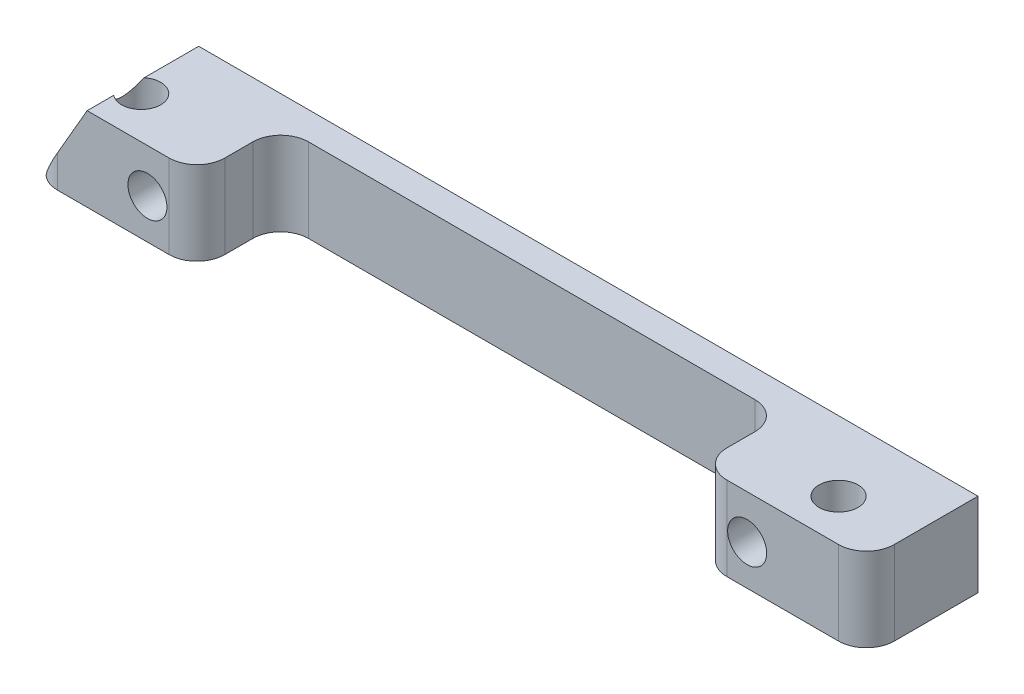
ISO-10303-21;
HEADER;
FILE_DESCRIPTION(('STEP AP214'),'2;1');
FILE_NAME('part.step','',(''),(''),'','','');
FILE_SCHEMA(('AUTOMOTIVE_DESIGN { 1 0 10303 214 1 1 1 1 }'));
ENDSEC;
DATA;
#1=APPLICATION_CONTEXT('core data for automotive mechanical design processes');
#2=APPLICATION_PROTOCOL_DEFINITION('international standard','automotive_design',2000,#1);
#3=PRODUCT_CONTEXT('',#1,'mechanical');
#4=PRODUCT('Part','Part','',(#3));
#5=PRODUCT_RELATED_PRODUCT_CATEGORY('part','',(#4));
#6=PRODUCT_DEFINITION_FORMATION('','',#4);
#7=PRODUCT_DEFINITION_CONTEXT('part definition',#1,'design');
#8=PRODUCT_DEFINITION('design','',#6,#7);
#9=PRODUCT_DEFINITION_SHAPE('','',#8);
#10=(LENGTH_UNIT() NAMED_UNIT(*) SI_UNIT(.MILLI.,.METRE.));
#11=(NAMED_UNIT(*) PLANE_ANGLE_UNIT() SI_UNIT($,.RADIAN.));
#12=(NAMED_UNIT(*) SI_UNIT($,.STERADIAN.) SOLID_ANGLE_UNIT());
#13=UNCERTAINTY_MEASURE_WITH_UNIT(LENGTH_MEASURE(1.E-05),#10,'distance_accuracy_value','');
#14=(GEOMETRIC_REPRESENTATION_CONTEXT(3) GLOBAL_UNCERTAINTY_ASSIGNED_CONTEXT((#13)) GLOBAL_UNIT_ASSIGNED_CONTEXT((#10,
#11,#12)) REPRESENTATION_CONTEXT('',''));
#15=CARTESIAN_POINT('',(0.,0.,0.));
#16=DIRECTION('',(0.,0.,1.));
#17=DIRECTION('',(1.,0.,0.));
#18=AXIS2_PLACEMENT_3D('',#15,#16,#17);
#19=CARTESIAN_POINT('',(-29.9999999999998,3.,2.));
#20=DIRECTION('',(0.,-1.,0.));
#21=DIRECTION('',(0.,0.,-1.));
#22=AXIS2_PLACEMENT_3D('',#19,#20,#21);
#23=PLANE('',#22);
#24=CARTESIAN_POINT('',(24.9999999999998,3.,5.));
#25=DIRECTION('',(0.,-1.,0.));
#26=DIRECTION('',(0.,0.,-1.));
#27=AXIS2_PLACEMENT_3D('',#24,#25,#26);
#28=CIRCLE('',#27,1.4);
#29=CARTESIAN_POINT('',(24.9999999999998,3.,3.6));
#30=VERTEX_POINT('',#29);
#31=EDGE_CURVE('E287',#30,#30,#28,.F.);
#32=ORIENTED_EDGE('',*,*,#31,.F.);
#33=EDGE_LOOP('',(#32));
#34=FACE_BOUND('',#33,.T.);
#35=DIRECTION('',(0.,0.,-1.));
#36=VECTOR('',#35,1.);
#37=CARTESIAN_POINT('',(-25.8754324738564,3.,8.00100000000001));
#38=LINE('',#37,#36);
#39=CARTESIAN_POINT('',(-25.8754324738564,3.,3.90747174694746));
#40=VERTEX_POINT('',#39);
#41=CARTESIAN_POINT('',(-25.8754324738564,3.,0.));
#42=VERTEX_POINT('',#41);
#43=EDGE_CURVE('E147',#40,#42,#38,.T.);
#44=ORIENTED_EDGE('',*,*,#43,.F.);
#45=CARTESIAN_POINT('',(-25.0000000000002,3.,5.));
#46=DIRECTION('',(0.,-1.,0.));
#47=DIRECTION('',(0.,0.,-1.));
#48=AXIS2_PLACEMENT_3D('',#45,#46,#47);
#49=CIRCLE('',#48,1.4);
#50=CARTESIAN_POINT('',(-25.8754324738564,3.,6.09252825305254));
#51=VERTEX_POINT('',#50);
#52=EDGE_CURVE('E46',#51,#40,#49,.F.);
#53=ORIENTED_EDGE('',*,*,#52,.F.);
#54=CARTESIAN_POINT('',(-25.8754324738564,3.,8.00000000000001));
#55=VERTEX_POINT('',#54);
#56=EDGE_CURVE('E144',#55,#51,#38,.T.);
#57=ORIENTED_EDGE('',*,*,#56,.F.);
#58=DIRECTION('',(-1.,0.,0.));
#59=VECTOR('',#58,1.);
#60=CARTESIAN_POINT('',(-25.0000000000002,3.,8.00000000000001));
#61=LINE('',#60,#59);
#62=CARTESIAN_POINT('',(-19.9999999999998,3.,8.00000000000001));
#63=VERTEX_POINT('',#62);
#64=EDGE_CURVE('E175',#63,#55,#61,.T.);
#65=ORIENTED_EDGE('',*,*,#64,.F.);
#66=CARTESIAN_POINT('',(-19.9999999999998,3.,6.00000000000001));
#67=DIRECTION('',(0.,-1.,0.));
#68=DIRECTION('',(0.,0.,-1.));
#69=AXIS2_PLACEMENT_3D('',#66,#67,#68);
#70=CIRCLE('',#69,2.);
#71=CARTESIAN_POINT('',(-17.9999999999998,3.,6.00000000000001));
#72=VERTEX_POINT('',#71);
#73=EDGE_CURVE('E234',#63,#72,#70,.F.);
#74=ORIENTED_EDGE('',*,*,#73,.T.);
#75=DIRECTION('',(0.,0.,1.));
#76=VECTOR('',#75,1.);
#77=CARTESIAN_POINT('',(-17.9999999999998,3.,8.00000000000001));
#78=LINE('',#77,#76);
#79=CARTESIAN_POINT('',(-17.9999999999998,3.,4.));
#80=VERTEX_POINT('',#79);
#81=EDGE_CURVE('E172',#80,#72,#78,.T.);
#82=ORIENTED_EDGE('',*,*,#81,.F.);
#83=CARTESIAN_POINT('',(-15.9999999999998,3.,4.));
#84=DIRECTION('',(0.,-1.,0.));
#85=DIRECTION('',(0.,0.,-1.));
#86=AXIS2_PLACEMENT_3D('',#83,#84,#85);
#87=CIRCLE('',#86,2.);
#88=CARTESIAN_POINT('',(-15.9999999999998,3.,2.));
#89=VERTEX_POINT('',#88);
#90=EDGE_CURVE('E244',#80,#89,#87,.T.);
#91=ORIENTED_EDGE('',*,*,#90,.T.);
#92=DIRECTION('',(-1.,0.,0.));
#93=VECTOR('',#92,1.);
#94=CARTESIAN_POINT('',(-29.9999999999998,3.,2.));
#95=LINE('',#94,#93);
#96=CARTESIAN_POINT('',(15.9999999999998,3.,2.));
#97=VERTEX_POINT('',#96);
#98=EDGE_CURVE('E183',#97,#89,#95,.T.);
#99=ORIENTED_EDGE('',*,*,#98,.F.);
#100=CARTESIAN_POINT('',(15.9999999999998,3.,4.));
#101=DIRECTION('',(0.,-1.,0.));
#102=DIRECTION('',(0.,0.,-1.));
#103=AXIS2_PLACEMENT_3D('',#100,#101,#102);
#104=CIRCLE('',#103,2.);
#105=CARTESIAN_POINT('',(17.9999999999998,3.,4.));
#106=VERTEX_POINT('',#105);
#107=EDGE_CURVE('E11',#97,#106,#104,.T.);
#108=ORIENTED_EDGE('',*,*,#107,.T.);
#109=DIRECTION('',(0.,0.,-1.));
#110=VECTOR('',#109,1.);
#111=CARTESIAN_POINT('',(17.9999999999998,3.,8.));
#112=LINE('',#111,#110);
#113=CARTESIAN_POINT('',(17.9999999999998,3.,6.));
#114=VERTEX_POINT('',#113);
#115=EDGE_CURVE('E163',#114,#106,#112,.T.);
#116=ORIENTED_EDGE('',*,*,#115,.F.);
#117=CARTESIAN_POINT('',(19.9999999999998,3.,6.));
#118=DIRECTION('',(0.,-1.,0.));
#119=DIRECTION('',(0.,0.,-1.));
#120=AXIS2_PLACEMENT_3D('',#117,#118,#119);
#121=CIRCLE('',#120,2.);
#122=CARTESIAN_POINT('',(19.9999999999998,3.,8.));
#123=VERTEX_POINT('',#122);
#124=EDGE_CURVE('E232',#114,#123,#121,.F.);
#125=ORIENTED_EDGE('',*,*,#124,.T.);
#126=DIRECTION('',(-1.,0.,0.));
#127=VECTOR('',#126,1.);
#128=CARTESIAN_POINT('',(29.9999999999998,3.,8.));
#129=LINE('',#128,#127);
#130=CARTESIAN_POINT('',(27.9999999999998,3.,8.));
#131=VERTEX_POINT('',#130);
#132=EDGE_CURVE('E160',#131,#123,#129,.T.);
#133=ORIENTED_EDGE('',*,*,#132,.F.);
#134=CARTESIAN_POINT('',(27.9999999999998,3.,6.));
#135=DIRECTION('',(0.,-1.,0.));
#136=DIRECTION('',(0.,0.,-1.));
#137=AXIS2_PLACEMENT_3D('',#134,#135,#136);
#138=CIRCLE('',#137,2.);
#139=CARTESIAN_POINT('',(29.9999999999998,3.,6.));
#140=VERTEX_POINT('',#139);
#141=EDGE_CURVE('E236',#131,#140,#138,.F.);
#142=ORIENTED_EDGE('',*,*,#141,.T.);
#143=DIRECTION('',(0.,0.,-1.));
#144=VECTOR('',#143,1.);
#145=CARTESIAN_POINT('',(29.9999999999998,3.,2.));
#146=LINE('',#145,#144);
#147=CARTESIAN_POINT('',(29.9999999999998,3.,0.));
#148=VERTEX_POINT('',#147);
#149=EDGE_CURVE('E198',#140,#148,#146,.T.);
#150=ORIENTED_EDGE('',*,*,#149,.T.);
#151=DIRECTION('',(-1.,0.,0.));
#152=VECTOR('',#151,1.);
#153=CARTESIAN_POINT('',(-29.9999999999998,3.,0.));
#154=LINE('',#153,#152);
#155=EDGE_CURVE('E193',#148,#42,#154,.T.);
#156=ORIENTED_EDGE('',*,*,#155,.T.);
#157=EDGE_LOOP('',(#44,#53,#57,#65,#74,#82,#91,#99,#108,#116,#125,#133,#142,#150,#156));
#158=FACE_BOUND('',#157,.T.);
#159=ADVANCED_FACE('F32',(#34,#158),#23,.F.);
#160=CARTESIAN_POINT('',(-29.9999999999998,-3.,2.));
#161=DIRECTION('',(0.,1.,0.));
#162=DIRECTION('',(0.,0.,1.));
#163=AXIS2_PLACEMENT_3D('',#160,#161,#162);
#164=PLANE('',#163);
#165=CARTESIAN_POINT('',(24.9999999999998,-3.,5.));
#166=DIRECTION('',(0.,-1.,0.));
#167=DIRECTION('',(0.,0.,-1.));
#168=AXIS2_PLACEMENT_3D('',#165,#166,#167);
#169=CIRCLE('',#168,1.4);
#170=CARTESIAN_POINT('',(24.9999999999998,-3.,3.6));
#171=VERTEX_POINT('',#170);
#172=EDGE_CURVE('E148',#171,#171,#169,.T.);
#173=ORIENTED_EDGE('',*,*,#172,.F.);
#174=EDGE_LOOP('',(#173));
#175=FACE_BOUND('',#174,.T.);
#176=CARTESIAN_POINT('',(-25.0000000000002,-3.,5.));
#177=DIRECTION('',(0.,-1.,0.));
#178=DIRECTION('',(0.,0.,-1.));
#179=AXIS2_PLACEMENT_3D('',#176,#177,#178);
#180=CIRCLE('',#179,1.4);
#181=CARTESIAN_POINT('',(-25.0000000000002,-3.,3.6));
#182=VERTEX_POINT('',#181);
#183=EDGE_CURVE('E139',#182,#182,#180,.T.);
#184=ORIENTED_EDGE('',*,*,#183,.F.);
#185=EDGE_LOOP('',(#184));
#186=FACE_BOUND('',#185,.T.);
#187=DIRECTION('',(0.,0.,-1.));
#188=VECTOR('',#187,1.);
#189=CARTESIAN_POINT('',(-29.3395340889941,-3.,8.00100000000001));
#190=LINE('',#189,#188);
#191=CARTESIAN_POINT('',(-29.3395340889941,-3.,7.48514256030264));
#192=VERTEX_POINT('',#191);
#193=CARTESIAN_POINT('',(-29.3395340889941,-3.,0.));
#194=VERTEX_POINT('',#193);
#195=EDGE_CURVE('E54',#192,#194,#190,.T.);
#196=ORIENTED_EDGE('',*,*,#195,.T.);
#197=DIRECTION('',(1.,0.,0.));
#198=VECTOR('',#197,1.);
#199=CARTESIAN_POINT('',(-29.9999999999998,-3.,0.));
#200=LINE('',#199,#198);
#201=CARTESIAN_POINT('',(29.9999999999998,-3.,0.));
#202=VERTEX_POINT('',#201);
#203=EDGE_CURVE('E187',#194,#202,#200,.T.);
#204=ORIENTED_EDGE('',*,*,#203,.T.);
#205=DIRECTION('',(0.,0.,-1.));
#206=VECTOR('',#205,1.);
#207=CARTESIAN_POINT('',(29.9999999999998,-3.,2.));
#208=LINE('',#207,#206);
#209=CARTESIAN_POINT('',(29.9999999999998,-3.,6.));
#210=VERTEX_POINT('',#209);
#211=EDGE_CURVE('E190',#210,#202,#208,.T.);
#212=ORIENTED_EDGE('',*,*,#211,.F.);
#213=CARTESIAN_POINT('',(27.9999999999998,-3.,6.));
#214=DIRECTION('',(0.,1.,0.));
#215=DIRECTION('',(0.,0.,1.));
#216=AXIS2_PLACEMENT_3D('',#213,#214,#215);
#217=CIRCLE('',#216,2.);
#218=CARTESIAN_POINT('',(27.9999999999998,-3.,8.));
#219=VERTEX_POINT('',#218);
#220=EDGE_CURVE('E225',#210,#219,#217,.F.);
#221=ORIENTED_EDGE('',*,*,#220,.T.);
#222=DIRECTION('',(1.,0.,0.));
#223=VECTOR('',#222,1.);
#224=CARTESIAN_POINT('',(29.9999999999998,-3.,8.));
#225=LINE('',#224,#223);
#226=CARTESIAN_POINT('',(19.9999999999998,-3.,8.));
#227=VERTEX_POINT('',#226);
#228=EDGE_CURVE('E164',#227,#219,#225,.T.);
#229=ORIENTED_EDGE('',*,*,#228,.F.);
#230=CARTESIAN_POINT('',(19.9999999999998,-3.,6.));
#231=DIRECTION('',(0.,1.,0.));
#232=DIRECTION('',(0.,0.,1.));
#233=AXIS2_PLACEMENT_3D('',#230,#231,#232);
#234=CIRCLE('',#233,2.);
#235=CARTESIAN_POINT('',(17.9999999999998,-3.,6.));
#236=VERTEX_POINT('',#235);
#237=EDGE_CURVE('E218',#227,#236,#234,.F.);
#238=ORIENTED_EDGE('',*,*,#237,.T.);
#239=DIRECTION('',(0.,0.,1.));
#240=VECTOR('',#239,1.);
#241=CARTESIAN_POINT('',(17.9999999999998,-3.,8.));
#242=LINE('',#241,#240);
#243=CARTESIAN_POINT('',(17.9999999999998,-3.,4.));
#244=VERTEX_POINT('',#243);
#245=EDGE_CURVE('E154',#244,#236,#242,.T.);
#246=ORIENTED_EDGE('',*,*,#245,.F.);
#247=CARTESIAN_POINT('',(15.9999999999998,-3.,4.));
#248=DIRECTION('',(0.,1.,0.));
#249=DIRECTION('',(0.,0.,1.));
#250=AXIS2_PLACEMENT_3D('',#247,#248,#249);
#251=CIRCLE('',#250,2.);
#252=CARTESIAN_POINT('',(15.9999999999998,-3.,2.));
#253=VERTEX_POINT('',#252);
#254=EDGE_CURVE('E40',#244,#253,#251,.T.);
#255=ORIENTED_EDGE('',*,*,#254,.T.);
#256=DIRECTION('',(1.,0.,0.));
#257=VECTOR('',#256,1.);
#258=CARTESIAN_POINT('',(-29.9999999999998,-3.,2.));
#259=LINE('',#258,#257);
#260=CARTESIAN_POINT('',(-15.9999999999998,-3.,2.));
#261=VERTEX_POINT('',#260);
#262=EDGE_CURVE('E186',#261,#253,#259,.T.);
#263=ORIENTED_EDGE('',*,*,#262,.F.);
#264=CARTESIAN_POINT('',(-15.9999999999998,-3.,4.));
#265=DIRECTION('',(0.,1.,0.));
#266=DIRECTION('',(0.,0.,1.));
#267=AXIS2_PLACEMENT_3D('',#264,#265,#266);
#268=CIRCLE('',#267,2.);
#269=CARTESIAN_POINT('',(-17.9999999999998,-3.,4.));
#270=VERTEX_POINT('',#269);
#271=EDGE_CURVE('E242',#261,#270,#268,.T.);
#272=ORIENTED_EDGE('',*,*,#271,.T.);
#273=DIRECTION('',(0.,0.,-1.));
#274=VECTOR('',#273,1.);
#275=CARTESIAN_POINT('',(-17.9999999999998,-3.,8.00000000000001));
#276=LINE('',#275,#274);
#277=CARTESIAN_POINT('',(-17.9999999999998,-3.,6.00000000000001));
#278=VERTEX_POINT('',#277);
#279=EDGE_CURVE('E176',#278,#270,#276,.T.);
#280=ORIENTED_EDGE('',*,*,#279,.F.);
#281=CARTESIAN_POINT('',(-19.9999999999998,-3.,6.00000000000001));
#282=DIRECTION('',(0.,1.,0.));
#283=DIRECTION('',(0.,0.,1.));
#284=AXIS2_PLACEMENT_3D('',#281,#282,#283);
#285=CIRCLE('',#284,2.);
#286=CARTESIAN_POINT('',(-19.9999999999998,-3.,8.00000000000001));
#287=VERTEX_POINT('',#286);
#288=EDGE_CURVE('E220',#278,#287,#285,.F.);
#289=ORIENTED_EDGE('',*,*,#288,.T.);
#290=DIRECTION('',(1.,0.,0.));
#291=VECTOR('',#290,1.);
#292=CARTESIAN_POINT('',(-25.0000000000002,-3.,8.00000000000001));
#293=LINE('',#292,#291);
#294=CARTESIAN_POINT('',(-27.9999999999998,-3.,8.00000000000001));
#295=VERTEX_POINT('',#294);
#296=EDGE_CURVE('E167',#295,#287,#293,.T.);
#297=ORIENTED_EDGE('',*,*,#296,.F.);
#298=CARTESIAN_POINT('',(-27.9999999999998,-3.,6.00000000000001));
#299=DIRECTION('',(0.,1.,0.));
#300=DIRECTION('',(0.,0.,1.));
#301=AXIS2_PLACEMENT_3D('',#298,#299,#300);
#302=CIRCLE('',#301,2.);
#303=EDGE_CURVE('E222',#295,#192,#302,.F.);
#304=ORIENTED_EDGE('',*,*,#303,.T.);
#305=EDGE_LOOP('',(#196,#204,#212,#221,#229,#238,#246,#255,#263,#272,#280,#289,#297,#304));
#306=FACE_BOUND('',#305,.T.);
#307=ADVANCED_FACE('F248',(#175,#186,#306),#164,.F.);
#308=CARTESIAN_POINT('',(0.,0.,0.));
#309=DIRECTION('',(0.,0.,1.));
#310=DIRECTION('',(1.,0.,0.));
#311=AXIS2_PLACEMENT_3D('',#308,#309,#310);
#312=PLANE('',#311);
#313=CARTESIAN_POINT('',(21.4479999999999,-0.126200000000067,0.));
#314=DIRECTION('',(0.,0.,1.));
#315=DIRECTION('',(1.,0.,0.));
#316=AXIS2_PLACEMENT_3D('',#313,#314,#315);
#317=CIRCLE('',#316,1.4);
#318=CARTESIAN_POINT('',(22.8479999999999,-0.126200000000067,0.));
#319=VERTEX_POINT('',#318);
#320=EDGE_CURVE('E292',#319,#319,#317,.T.);
#321=ORIENTED_EDGE('',*,*,#320,.T.);
#322=EDGE_LOOP('',(#321));
#323=FACE_BOUND('',#322,.T.);
#324=CARTESIAN_POINT('',(-21.5520000000001,-0.126200000000369,0.));
#325=DIRECTION('',(0.,0.,1.));
#326=DIRECTION('',(1.,0.,0.));
#327=AXIS2_PLACEMENT_3D('',#324,#325,#326);
#328=CIRCLE('',#327,1.4);
#329=CARTESIAN_POINT('',(-20.1520000000001,-0.126200000000369,0.));
#330=VERTEX_POINT('',#329);
#331=EDGE_CURVE('E300',#330,#330,#328,.T.);
#332=ORIENTED_EDGE('',*,*,#331,.T.);
#333=EDGE_LOOP('',(#332));
#334=FACE_BOUND('',#333,.T.);
#335=DIRECTION('',(0.499999999999998,0.86602540378444,0.));
#336=VECTOR('',#335,1.);
#337=CARTESIAN_POINT('',(-25.8754324738564,3.,0.));
#338=LINE('',#337,#336);
#339=EDGE_CURVE('E156',#194,#42,#338,.T.);
#340=ORIENTED_EDGE('',*,*,#339,.T.);
#341=ORIENTED_EDGE('',*,*,#155,.F.);
#342=DIRECTION('',(0.,1.,0.));
#343=VECTOR('',#342,1.);
#344=CARTESIAN_POINT('',(29.9999999999998,3.,0.));
#345=LINE('',#344,#343);
#346=EDGE_CURVE('E178',#202,#148,#345,.T.);
#347=ORIENTED_EDGE('',*,*,#346,.F.);
#348=ORIENTED_EDGE('',*,*,#203,.F.);
#349=EDGE_LOOP('',(#340,#341,#347,#348));
#350=FACE_BOUND('',#349,.T.);
#351=ADVANCED_FACE('F283',(#323,#334,#350),#312,.F.);
#352=CARTESIAN_POINT('',(-25.0000000000002,16.4164078649987,8.00000000000001));
#353=DIRECTION('',(0.,0.,-1.));
#354=DIRECTION('',(-1.,0.,0.));
#355=AXIS2_PLACEMENT_3D('',#352,#353,#354);
#356=PLANE('',#355);
#357=CARTESIAN_POINT('',(-21.5520000000001,-0.126200000000369,8.00000000000001));
#358=DIRECTION('',(0.,0.,-1.));
#359=DIRECTION('',(-1.,0.,0.));
#360=AXIS2_PLACEMENT_3D('',#357,#358,#359);
#361=CIRCLE('',#360,1.4);
#362=CARTESIAN_POINT('',(-22.9520000000001,-0.126200000000369,8.00000000000001));
#363=VERTEX_POINT('',#362);
#364=EDGE_CURVE('E297',#363,#363,#361,.T.);
#365=ORIENTED_EDGE('',*,*,#364,.T.);
#366=EDGE_LOOP('',(#365));
#367=FACE_BOUND('',#366,.T.);
#368=DIRECTION('',(-0.499999999999998,-0.86602540378444,0.));
#369=VECTOR('',#368,1.);
#370=CARTESIAN_POINT('',(-25.8754324738564,3.,8.00000000000001));
#371=LINE('',#370,#369);
#372=CARTESIAN_POINT('',(-27.9999999999998,-0.6798588993914,8.00000000000001));
#373=VERTEX_POINT('',#372);
#374=EDGE_CURVE('E152',#55,#373,#371,.T.);
#375=ORIENTED_EDGE('',*,*,#374,.T.);
#376=DIRECTION('',(0.,-1.,0.));
#377=VECTOR('',#376,1.);
#378=CARTESIAN_POINT('',(-27.9999999999998,16.4164078649987,8.00000000000001));
#379=LINE('',#378,#377);
#380=EDGE_CURVE('E240',#373,#295,#379,.T.);
#381=ORIENTED_EDGE('',*,*,#380,.T.);
#382=ORIENTED_EDGE('',*,*,#296,.T.);
#383=DIRECTION('',(0.,-1.,0.));
#384=VECTOR('',#383,1.);
#385=CARTESIAN_POINT('',(-19.9999999999998,16.4164078649987,8.00000000000001));
#386=LINE('',#385,#384);
#387=EDGE_CURVE('E238',#287,#63,#386,.F.);
#388=ORIENTED_EDGE('',*,*,#387,.T.);
#389=ORIENTED_EDGE('',*,*,#64,.T.);
#390=EDGE_LOOP('',(#375,#381,#382,#388,#389));
#391=FACE_BOUND('',#390,.T.);
#392=ADVANCED_FACE('F354',(#367,#391),#356,.F.);
#393=CARTESIAN_POINT('',(-27.9999999999998,16.4164078649987,6.00000000000001));
#394=DIRECTION('',(0.,-1.,0.));
#395=DIRECTION('',(0.,0.,-1.));
#396=AXIS2_PLACEMENT_3D('',#393,#394,#395);
#397=CYLINDRICAL_SURFACE('',#396,2.);
#398=ORIENTED_EDGE('',*,*,#380,.F.);
#399=CARTESIAN_POINT('',(-27.9999999999998,-0.6798588993914,6.00000000000001));
#400=DIRECTION('',(-0.86602540378444,0.499999999999998,0.));
#401=DIRECTION('',(-0.499999999999998,-0.86602540378444,0.));
#402=AXIS2_PLACEMENT_3D('',#399,#400,#401);
#403=ELLIPSE('',#402,4.00000000000002,2.);
#404=EDGE_CURVE('E284',#192,#373,#403,.T.);
#405=ORIENTED_EDGE('',*,*,#404,.F.);
#406=ORIENTED_EDGE('',*,*,#303,.F.);
#407=EDGE_LOOP('',(#398,#405,#406));
#408=FACE_BOUND('',#407,.T.);
#409=ADVANCED_FACE('F352',(#408),#397,.T.);
#410=CARTESIAN_POINT('',(0.,0.,2.));
#411=DIRECTION('',(0.,0.,1.));
#412=DIRECTION('',(1.,0.,0.));
#413=AXIS2_PLACEMENT_3D('',#410,#411,#412);
#414=PLANE('',#413);
#415=ORIENTED_EDGE('',*,*,#98,.T.);
#416=DIRECTION('',(0.,-1.,0.));
#417=VECTOR('',#416,1.);
#418=CARTESIAN_POINT('',(-15.9999999999998,0.,2.));
#419=LINE('',#418,#417);
#420=EDGE_CURVE('E202',#89,#261,#419,.T.);
#421=ORIENTED_EDGE('',*,*,#420,.T.);
#422=ORIENTED_EDGE('',*,*,#262,.T.);
#423=DIRECTION('',(0.,-1.,0.));
#424=VECTOR('',#423,1.);
#425=CARTESIAN_POINT('',(15.9999999999998,0.,2.));
#426=LINE('',#425,#424);
#427=EDGE_CURVE('E200',#253,#97,#426,.F.);
#428=ORIENTED_EDGE('',*,*,#427,.T.);
#429=EDGE_LOOP('',(#415,#421,#422,#428));
#430=FACE_BOUND('',#429,.T.);
#431=ADVANCED_FACE('F253',(#430),#414,.T.);
#432=CARTESIAN_POINT('',(29.9999999999998,3.,2.));
#433=DIRECTION('',(-1.,0.,0.));
#434=DIRECTION('',(0.,0.,1.));
#435=AXIS2_PLACEMENT_3D('',#432,#433,#434);
#436=PLANE('',#435);
#437=ORIENTED_EDGE('',*,*,#149,.F.);
#438=DIRECTION('',(0.,-1.,0.));
#439=VECTOR('',#438,1.);
#440=CARTESIAN_POINT('',(29.9999999999998,3.,6.));
#441=LINE('',#440,#439);
#442=EDGE_CURVE('E215',#140,#210,#441,.T.);
#443=ORIENTED_EDGE('',*,*,#442,.T.);
#444=ORIENTED_EDGE('',*,*,#211,.T.);
#445=ORIENTED_EDGE('',*,*,#346,.T.);
#446=EDGE_LOOP('',(#437,#443,#444,#445));
#447=FACE_BOUND('',#446,.T.);
#448=ADVANCED_FACE('F277',(#447),#436,.F.);
#449=CARTESIAN_POINT('',(-17.9999999999998,16.4164078649987,8.00000000000001));
#450=DIRECTION('',(-1.,0.,0.));
#451=DIRECTION('',(0.,0.,1.));
#452=AXIS2_PLACEMENT_3D('',#449,#450,#451);
#453=PLANE('',#452);
#454=ORIENTED_EDGE('',*,*,#279,.T.);
#455=DIRECTION('',(0.,-1.,0.));
#456=VECTOR('',#455,1.);
#457=CARTESIAN_POINT('',(-17.9999999999998,16.4164078649987,4.));
#458=LINE('',#457,#456);
#459=EDGE_CURVE('E208',#270,#80,#458,.F.);
#460=ORIENTED_EDGE('',*,*,#459,.T.);
#461=ORIENTED_EDGE('',*,*,#81,.T.);
#462=DIRECTION('',(0.,-1.,0.));
#463=VECTOR('',#462,1.);
#464=CARTESIAN_POINT('',(-17.9999999999998,16.4164078649987,6.00000000000001));
#465=LINE('',#464,#463);
#466=EDGE_CURVE('E205',#72,#278,#465,.T.);
#467=ORIENTED_EDGE('',*,*,#466,.T.);
#468=EDGE_LOOP('',(#454,#460,#461,#467));
#469=FACE_BOUND('',#468,.T.);
#470=ADVANCED_FACE('F320',(#469),#453,.F.);
#471=CARTESIAN_POINT('',(29.9999999999998,16.4164078649987,8.));
#472=DIRECTION('',(0.,0.,-1.));
#473=DIRECTION('',(-1.,0.,0.));
#474=AXIS2_PLACEMENT_3D('',#471,#472,#473);
#475=PLANE('',#474);
#476=CARTESIAN_POINT('',(21.4479999999999,-0.126200000000067,8.));
#477=DIRECTION('',(0.,0.,-1.));
#478=DIRECTION('',(-1.,0.,0.));
#479=AXIS2_PLACEMENT_3D('',#476,#477,#478);
#480=CIRCLE('',#479,1.4);
#481=CARTESIAN_POINT('',(20.0479999999999,-0.126200000000067,8.));
#482=VERTEX_POINT('',#481);
#483=EDGE_CURVE('E303',#482,#482,#480,.T.);
#484=ORIENTED_EDGE('',*,*,#483,.T.);
#485=EDGE_LOOP('',(#484));
#486=FACE_BOUND('',#485,.T.);
#487=ORIENTED_EDGE('',*,*,#228,.T.);
#488=DIRECTION('',(0.,-1.,0.));
#489=VECTOR('',#488,1.);
#490=CARTESIAN_POINT('',(27.9999999999998,16.4164078649987,8.));
#491=LINE('',#490,#489);
#492=EDGE_CURVE('E230',#219,#131,#491,.F.);
#493=ORIENTED_EDGE('',*,*,#492,.T.);
#494=ORIENTED_EDGE('',*,*,#132,.T.);
#495=DIRECTION('',(0.,-1.,0.));
#496=VECTOR('',#495,1.);
#497=CARTESIAN_POINT('',(19.9999999999998,16.4164078649987,8.));
#498=LINE('',#497,#496);
#499=EDGE_CURVE('E227',#123,#227,#498,.T.);
#500=ORIENTED_EDGE('',*,*,#499,.T.);
#501=EDGE_LOOP('',(#487,#493,#494,#500));
#502=FACE_BOUND('',#501,.T.);
#503=ADVANCED_FACE('F268',(#486,#502),#475,.F.);
#504=CARTESIAN_POINT('',(17.9999999999998,16.4164078649987,8.));
#505=DIRECTION('',(1.,0.,0.));
#506=DIRECTION('',(0.,0.,-1.));
#507=AXIS2_PLACEMENT_3D('',#504,#505,#506);
#508=PLANE('',#507);
#509=ORIENTED_EDGE('',*,*,#115,.T.);
#510=DIRECTION('',(0.,-1.,0.));
#511=VECTOR('',#510,1.);
#512=CARTESIAN_POINT('',(17.9999999999998,16.4164078649987,4.));
#513=LINE('',#512,#511);
#514=EDGE_CURVE('E212',#106,#244,#513,.T.);
#515=ORIENTED_EDGE('',*,*,#514,.T.);
#516=ORIENTED_EDGE('',*,*,#245,.T.);
#517=DIRECTION('',(0.,-1.,0.));
#518=VECTOR('',#517,1.);
#519=CARTESIAN_POINT('',(17.9999999999998,16.4164078649987,6.));
#520=LINE('',#519,#518);
#521=EDGE_CURVE('E210',#236,#114,#520,.F.);
#522=ORIENTED_EDGE('',*,*,#521,.T.);
#523=EDGE_LOOP('',(#509,#515,#516,#522));
#524=FACE_BOUND('',#523,.T.);
#525=ADVANCED_FACE('F261',(#524),#508,.F.);
#526=CARTESIAN_POINT('',(-15.9999999999998,0.,4.));
#527=DIRECTION('',(0.,-1.,0.));
#528=DIRECTION('',(0.,0.,-1.));
#529=AXIS2_PLACEMENT_3D('',#526,#527,#528);
#530=CYLINDRICAL_SURFACE('',#529,2.);
#531=ORIENTED_EDGE('',*,*,#90,.F.);
#532=ORIENTED_EDGE('',*,*,#459,.F.);
#533=ORIENTED_EDGE('',*,*,#271,.F.);
#534=ORIENTED_EDGE('',*,*,#420,.F.);
#535=EDGE_LOOP('',(#531,#532,#533,#534));
#536=FACE_BOUND('',#535,.T.);
#537=ADVANCED_FACE('F326',(#536),#530,.F.);
#538=CARTESIAN_POINT('',(15.9999999999998,16.4164078649987,4.));
#539=DIRECTION('',(0.,-1.,0.));
#540=DIRECTION('',(0.,0.,-1.));
#541=AXIS2_PLACEMENT_3D('',#538,#539,#540);
#542=CYLINDRICAL_SURFACE('',#541,2.);
#543=ORIENTED_EDGE('',*,*,#107,.F.);
#544=ORIENTED_EDGE('',*,*,#427,.F.);
#545=ORIENTED_EDGE('',*,*,#254,.F.);
#546=ORIENTED_EDGE('',*,*,#514,.F.);
#547=EDGE_LOOP('',(#543,#544,#545,#546));
#548=FACE_BOUND('',#547,.T.);
#549=ADVANCED_FACE('F257',(#548),#542,.F.);
#550=CARTESIAN_POINT('',(27.9999999999998,3.,6.));
#551=DIRECTION('',(0.,-1.,0.));
#552=DIRECTION('',(0.,0.,-1.));
#553=AXIS2_PLACEMENT_3D('',#550,#551,#552);
#554=CYLINDRICAL_SURFACE('',#553,2.);
#555=ORIENTED_EDGE('',*,*,#141,.F.);
#556=ORIENTED_EDGE('',*,*,#492,.F.);
#557=ORIENTED_EDGE('',*,*,#220,.F.);
#558=ORIENTED_EDGE('',*,*,#442,.F.);
#559=EDGE_LOOP('',(#555,#556,#557,#558));
#560=FACE_BOUND('',#559,.T.);
#561=ADVANCED_FACE('F272',(#560),#554,.T.);
#562=CARTESIAN_POINT('',(-19.9999999999998,16.4164078649987,6.00000000000001));
#563=DIRECTION('',(0.,-1.,0.));
#564=DIRECTION('',(0.,0.,-1.));
#565=AXIS2_PLACEMENT_3D('',#562,#563,#564);
#566=CYLINDRICAL_SURFACE('',#565,2.);
#567=ORIENTED_EDGE('',*,*,#73,.F.);
#568=ORIENTED_EDGE('',*,*,#387,.F.);
#569=ORIENTED_EDGE('',*,*,#288,.F.);
#570=ORIENTED_EDGE('',*,*,#466,.F.);
#571=EDGE_LOOP('',(#567,#568,#569,#570));
#572=FACE_BOUND('',#571,.T.);
#573=ADVANCED_FACE('F351',(#572),#566,.T.);
#574=CARTESIAN_POINT('',(19.9999999999998,16.4164078649987,6.));
#575=DIRECTION('',(0.,-1.,0.));
#576=DIRECTION('',(0.,0.,-1.));
#577=AXIS2_PLACEMENT_3D('',#574,#575,#576);
#578=CYLINDRICAL_SURFACE('',#577,2.);
#579=ORIENTED_EDGE('',*,*,#124,.F.);
#580=ORIENTED_EDGE('',*,*,#521,.F.);
#581=ORIENTED_EDGE('',*,*,#237,.F.);
#582=ORIENTED_EDGE('',*,*,#499,.F.);
#583=EDGE_LOOP('',(#579,#580,#581,#582));
#584=FACE_BOUND('',#583,.T.);
#585=ADVANCED_FACE('F34',(#584),#578,.T.);
#586=CARTESIAN_POINT('',(-25.8754324738564,3.,8.00100000000001));
#587=DIRECTION('',(-0.86602540378444,0.499999999999998,0.));
#588=DIRECTION('',(-0.499999999999998,-0.86602540378444,0.));
#589=AXIS2_PLACEMENT_3D('',#586,#587,#588);
#590=PLANE('',#589);
#591=CARTESIAN_POINT('',(-25.0000000000002,4.51629352331464,5.));
#592=DIRECTION('',(-0.86602540378444,0.499999999999998,0.));
#593=DIRECTION('',(-0.499999999999998,-0.86602540378444,0.));
#594=AXIS2_PLACEMENT_3D('',#591,#592,#593);
#595=ELLIPSE('',#594,2.80000000000001,1.4);
#596=EDGE_CURVE('E135',#51,#40,#595,.F.);
#597=ORIENTED_EDGE('',*,*,#596,.T.);
#598=ORIENTED_EDGE('',*,*,#43,.T.);
#599=ORIENTED_EDGE('',*,*,#339,.F.);
#600=ORIENTED_EDGE('',*,*,#195,.F.);
#601=ORIENTED_EDGE('',*,*,#404,.T.);
#602=ORIENTED_EDGE('',*,*,#374,.F.);
#603=ORIENTED_EDGE('',*,*,#56,.T.);
#604=EDGE_LOOP('',(#597,#598,#599,#600,#601,#602,#603));
#605=FACE_BOUND('',#604,.T.);
#606=ADVANCED_FACE('F150',(#605),#590,.T.);
#607=CARTESIAN_POINT('',(-25.0000000000002,3.001,5.));
#608=DIRECTION('',(0.,-1.,0.));
#609=DIRECTION('',(0.,0.,-1.));
#610=AXIS2_PLACEMENT_3D('',#607,#608,#609);
#611=CYLINDRICAL_SURFACE('',#610,1.4);
#612=ORIENTED_EDGE('',*,*,#183,.T.);
#613=EDGE_LOOP('',(#612));
#614=FACE_BOUND('',#613,.T.);
#615=ORIENTED_EDGE('',*,*,#52,.T.);
#616=ORIENTED_EDGE('',*,*,#596,.F.);
#617=EDGE_LOOP('',(#615,#616));
#618=FACE_BOUND('',#617,.T.);
#619=ADVANCED_FACE('F136',(#614,#618),#611,.F.);
#620=CARTESIAN_POINT('',(24.9999999999998,3.001,5.));
#621=DIRECTION('',(0.,-1.,0.));
#622=DIRECTION('',(0.,0.,-1.));
#623=AXIS2_PLACEMENT_3D('',#620,#621,#622);
#624=CYLINDRICAL_SURFACE('',#623,1.4);
#625=CARTESIAN_POINT('',(24.9999999999998,-3.,3.6));
#626=CARTESIAN_POINT('',(24.9999999999998,-2.9375,3.6));
#627=CARTESIAN_POINT('',(24.9999999999998,-2.875,3.6));
#628=CARTESIAN_POINT('',(24.9999999999998,-2.75,3.6));
#629=CARTESIAN_POINT('',(24.9999999999998,-2.6875,3.6));
#630=CARTESIAN_POINT('',(24.9999999999998,-2.5625,3.6));
#631=CARTESIAN_POINT('',(24.9999999999998,-2.5,3.6));
#632=CARTESIAN_POINT('',(24.9999999999998,-2.375,3.6));
#633=CARTESIAN_POINT('',(24.9999999999998,-2.3125,3.6));
#634=CARTESIAN_POINT('',(24.9999999999998,-2.1875,3.6));
#635=CARTESIAN_POINT('',(24.9999999999998,-2.125,3.6));
#636=CARTESIAN_POINT('',(24.9999999999998,-2.,3.6));
#637=CARTESIAN_POINT('',(24.9999999999998,-1.9375,3.6));
#638=CARTESIAN_POINT('',(24.9999999999998,-1.8125,3.6));
#639=CARTESIAN_POINT('',(24.9999999999998,-1.75,3.6));
#640=CARTESIAN_POINT('',(24.9999999999998,-1.625,3.6));
#641=CARTESIAN_POINT('',(24.9999999999998,-1.5625,3.6));
#642=CARTESIAN_POINT('',(24.9999999999998,-1.4375,3.6));
#643=CARTESIAN_POINT('',(24.9999999999998,-1.375,3.6));
#644=CARTESIAN_POINT('',(24.9999999999998,-1.25,3.6));
#645=CARTESIAN_POINT('',(24.9999999999998,-1.1875,3.6));
#646=CARTESIAN_POINT('',(24.9999999999998,-1.0625,3.6));
#647=CARTESIAN_POINT('',(24.9999999999998,-1.,3.6));
#648=CARTESIAN_POINT('',(24.9999999999998,-0.875,3.6));
#649=CARTESIAN_POINT('',(24.9999999999998,-0.8125,3.6));
#650=CARTESIAN_POINT('',(24.9999999999998,-0.6875,3.6));
#651=CARTESIAN_POINT('',(24.9999999999998,-0.625,3.6));
#652=CARTESIAN_POINT('',(24.9999999999998,-0.5,3.6));
#653=CARTESIAN_POINT('',(24.9999999999998,-0.4375,3.6));
#654=CARTESIAN_POINT('',(24.9999999999998,-0.3125,3.6));
#655=CARTESIAN_POINT('',(24.9999999999998,-0.25,3.6));
#656=CARTESIAN_POINT('',(24.9999999999998,-0.125,3.6));
#657=CARTESIAN_POINT('',(24.9999999999998,-0.0625,3.6));
#658=CARTESIAN_POINT('',(24.9999999999998,0.0625,3.6));
#659=CARTESIAN_POINT('',(24.9999999999998,0.125,3.6));
#660=CARTESIAN_POINT('',(24.9999999999998,0.25,3.6));
#661=CARTESIAN_POINT('',(24.9999999999998,0.3125,3.6));
#662=CARTESIAN_POINT('',(24.9999999999998,0.4375,3.6));
#663=CARTESIAN_POINT('',(24.9999999999998,0.5,3.6));
#664=CARTESIAN_POINT('',(24.9999999999998,0.625,3.6));
#665=CARTESIAN_POINT('',(24.9999999999998,0.6875,3.6));
#666=CARTESIAN_POINT('',(24.9999999999998,0.8125,3.6));
#667=CARTESIAN_POINT('',(24.9999999999998,0.875,3.6));
#668=CARTESIAN_POINT('',(24.9999999999998,1.,3.6));
#669=CARTESIAN_POINT('',(24.9999999999998,1.0625,3.6));
#670=CARTESIAN_POINT('',(24.9999999999998,1.1875,3.6));
#671=CARTESIAN_POINT('',(24.9999999999998,1.25,3.6));
#672=CARTESIAN_POINT('',(24.9999999999998,1.375,3.6));
#673=CARTESIAN_POINT('',(24.9999999999998,1.4375,3.6));
#674=CARTESIAN_POINT('',(24.9999999999998,1.5625,3.6));
#675=CARTESIAN_POINT('',(24.9999999999998,1.625,3.6));
#676=CARTESIAN_POINT('',(24.9999999999998,1.75,3.6));
#677=CARTESIAN_POINT('',(24.9999999999998,1.8125,3.6));
#678=CARTESIAN_POINT('',(24.9999999999998,1.9375,3.6));
#679=CARTESIAN_POINT('',(24.9999999999998,2.,3.6));
#680=CARTESIAN_POINT('',(24.9999999999998,2.125,3.6));
#681=CARTESIAN_POINT('',(24.9999999999998,2.1875,3.6));
#682=CARTESIAN_POINT('',(24.9999999999998,2.3125,3.6));
#683=CARTESIAN_POINT('',(24.9999999999998,2.375,3.6));
#684=CARTESIAN_POINT('',(24.9999999999998,2.5,3.6));
#685=CARTESIAN_POINT('',(24.9999999999998,2.5625,3.6));
#686=CARTESIAN_POINT('',(24.9999999999998,2.6875,3.6));
#687=CARTESIAN_POINT('',(24.9999999999998,2.75,3.6));
#688=CARTESIAN_POINT('',(24.9999999999998,2.875,3.6));
#689=CARTESIAN_POINT('',(24.9999999999998,2.9375,3.6));
#690=CARTESIAN_POINT('',(24.9999999999998,3.,3.6));
#691=B_SPLINE_CURVE_WITH_KNOTS('',3,(#625,#626,#627,#628,#629,#630,#631,#632,#633,#634,#635,
#636,#637,#638,#639,#640,#641,#642,#643,#644,#645,#646,#647,#648,#649,#650,#651,#652,#653,#654,
#655,#656,#657,#658,#659,#660,#661,#662,#663,#664,#665,#666,#667,#668,#669,#670,#671,#672,#673,
#674,#675,#676,#677,#678,#679,#680,#681,#682,#683,#684,#685,#686,#687,#688,#689,#690),
.UNSPECIFIED.,.F.,.F.,(4,2,2,2,2,2,2,2,2,2,2,2,2,2,2,2,2,2,2,2,2,2,2,2,2,2,2,2,2,2,2,2,4),(0.,
0.1875,0.375,0.5625,0.75,0.9375,1.125,1.3125,1.5,1.6875,1.875,2.0625,2.25,2.4375,2.625,2.8125,
3.,3.1875,3.375,3.5625,3.75,3.9375,4.125,4.3125,4.5,4.6875,4.875,5.0625,5.25,5.4375,5.625,
5.8125,6.),.UNSPECIFIED.);
#692=EDGE_CURVE('BSEAM315',#171,#30,#691,.T.);
#693=ORIENTED_EDGE('',*,*,#172,.T.);
#694=ORIENTED_EDGE('',*,*,#31,.T.);
#695=ORIENTED_EDGE('',*,*,#692,.T.);
#696=ORIENTED_EDGE('',*,*,#692,.F.);
#697=EDGE_LOOP('',(#693,#695,#694,#696));
#698=FACE_BOUND('',#697,.T.);
#699=ADVANCED_FACE('F315',(#698),#624,.F.);
#700=CARTESIAN_POINT('',(21.4479999999999,-0.126200000000067,8.00100000000001));
#701=DIRECTION('',(0.,0.,-1.));
#702=DIRECTION('',(-1.,0.,0.));
#703=AXIS2_PLACEMENT_3D('',#700,#701,#702);
#704=CYLINDRICAL_SURFACE('',#703,1.4);
#705=ORIENTED_EDGE('',*,*,#320,.F.);
#706=EDGE_LOOP('',(#705));
#707=FACE_BOUND('',#706,.T.);
#708=ORIENTED_EDGE('',*,*,#483,.F.);
#709=EDGE_LOOP('',(#708));
#710=FACE_BOUND('',#709,.T.);
#711=ADVANCED_FACE('F311',(#707,#710),#704,.F.);
#712=CARTESIAN_POINT('',(-21.5520000000001,-0.126200000000369,8.00100000000001));
#713=DIRECTION('',(0.,0.,-1.));
#714=DIRECTION('',(-1.,0.,0.));
#715=AXIS2_PLACEMENT_3D('',#712,#713,#714);
#716=CYLINDRICAL_SURFACE('',#715,1.4);
#717=ORIENTED_EDGE('',*,*,#331,.F.);
#718=EDGE_LOOP('',(#717));
#719=FACE_BOUND('',#718,.T.);
#720=ORIENTED_EDGE('',*,*,#364,.F.);
#721=EDGE_LOOP('',(#720));
#722=FACE_BOUND('',#721,.T.);
#723=ADVANCED_FACE('F314',(#719,#722),#716,.F.);
#724=CLOSED_SHELL('',(#159,#307,#351,#392,#409,#431,#448,#470,#503,#525,#537,#549,#561,#573,
#585,#606,#619,#699,#711,#723));
#725=MANIFOLD_SOLID_BREP('B2',#724);
#726=ADVANCED_BREP_SHAPE_REPRESENTATION('',(#18,#725),#14);
#727=SHAPE_DEFINITION_REPRESENTATION(#9,#726);
ENDSEC;
END-ISO-10303-21;
